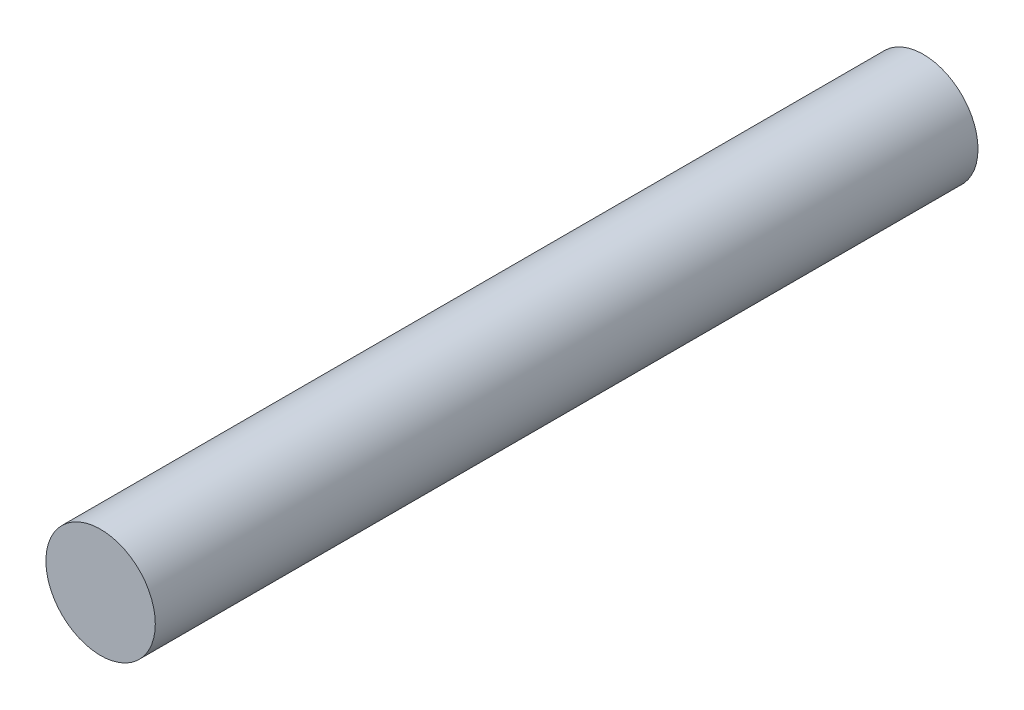
ISO-10303-21;
HEADER;
FILE_DESCRIPTION(('STEP AP214'),'2;1');
FILE_NAME('part.step','',(''),(''),'','','');
FILE_SCHEMA(('AUTOMOTIVE_DESIGN { 1 0 10303 214 1 1 1 1 }'));
ENDSEC;
DATA;
#1=APPLICATION_CONTEXT('core data for automotive mechanical design processes');
#2=APPLICATION_PROTOCOL_DEFINITION('international standard','automotive_design',2000,#1);
#3=PRODUCT_CONTEXT('',#1,'mechanical');
#4=PRODUCT('Part','Part','',(#3));
#5=PRODUCT_RELATED_PRODUCT_CATEGORY('part','',(#4));
#6=PRODUCT_DEFINITION_FORMATION('','',#4);
#7=PRODUCT_DEFINITION_CONTEXT('part definition',#1,'design');
#8=PRODUCT_DEFINITION('design','',#6,#7);
#9=PRODUCT_DEFINITION_SHAPE('','',#8);
#10=(LENGTH_UNIT() NAMED_UNIT(*) SI_UNIT(.MILLI.,.METRE.));
#11=(NAMED_UNIT(*) PLANE_ANGLE_UNIT() SI_UNIT($,.RADIAN.));
#12=(NAMED_UNIT(*) SI_UNIT($,.STERADIAN.) SOLID_ANGLE_UNIT());
#13=UNCERTAINTY_MEASURE_WITH_UNIT(LENGTH_MEASURE(1.E-05),#10,'distance_accuracy_value','');
#14=(GEOMETRIC_REPRESENTATION_CONTEXT(3) GLOBAL_UNCERTAINTY_ASSIGNED_CONTEXT((#13)) GLOBAL_UNIT_ASSIGNED_CONTEXT((#10,
#11,#12)) REPRESENTATION_CONTEXT('',''));
#15=CARTESIAN_POINT('',(0.,0.,0.));
#16=DIRECTION('',(0.,0.,1.));
#17=DIRECTION('',(1.,0.,0.));
#18=AXIS2_PLACEMENT_3D('',#15,#16,#17);
#19=CARTESIAN_POINT('',(0.,0.,47.752));
#20=DIRECTION('',(0.,0.,-1.));
#21=DIRECTION('',(-1.,0.,0.));
#22=AXIS2_PLACEMENT_3D('',#19,#20,#21);
#23=CYLINDRICAL_SURFACE('',#22,3.175);
#24=CARTESIAN_POINT('',(0.,0.,47.752));
#25=DIRECTION('',(0.,0.,1.));
#26=DIRECTION('',(1.,0.,0.));
#27=AXIS2_PLACEMENT_3D('',#24,#25,#26);
#28=CIRCLE('',#27,3.175);
#29=CARTESIAN_POINT('',(3.175,0.,47.752));
#30=VERTEX_POINT('',#29);
#31=EDGE_CURVE('E10',#30,#30,#28,.T.);
#32=ORIENTED_EDGE('',*,*,#31,.F.);
#33=EDGE_LOOP('',(#32));
#34=FACE_BOUND('',#33,.T.);
#35=CARTESIAN_POINT('',(0.,0.,0.));
#36=DIRECTION('',(0.,0.,1.));
#37=DIRECTION('',(1.,0.,0.));
#38=AXIS2_PLACEMENT_3D('',#35,#36,#37);
#39=CIRCLE('',#38,3.175);
#40=CARTESIAN_POINT('',(3.175,0.,0.));
#41=VERTEX_POINT('',#40);
#42=EDGE_CURVE('E34',#41,#41,#39,.T.);
#43=ORIENTED_EDGE('',*,*,#42,.T.);
#44=EDGE_LOOP('',(#43));
#45=FACE_BOUND('',#44,.T.);
#46=ADVANCED_FACE('F31',(#34,#45),#23,.T.);
#47=CARTESIAN_POINT('',(0.,0.,47.752));
#48=DIRECTION('',(0.,0.,1.));
#49=DIRECTION('',(1.,0.,0.));
#50=AXIS2_PLACEMENT_3D('',#47,#48,#49);
#51=PLANE('',#50);
#52=ORIENTED_EDGE('',*,*,#31,.T.);
#53=EDGE_LOOP('',(#52));
#54=FACE_BOUND('',#53,.T.);
#55=ADVANCED_FACE('F46',(#54),#51,.T.);
#56=CARTESIAN_POINT('',(0.,0.,0.));
#57=DIRECTION('',(0.,0.,1.));
#58=DIRECTION('',(1.,0.,0.));
#59=AXIS2_PLACEMENT_3D('',#56,#57,#58);
#60=PLANE('',#59);
#61=ORIENTED_EDGE('',*,*,#42,.F.);
#62=EDGE_LOOP('',(#61));
#63=FACE_BOUND('',#62,.T.);
#64=ADVANCED_FACE('F44',(#63),#60,.F.);
#65=CLOSED_SHELL('',(#46,#55,#64));
#66=MANIFOLD_SOLID_BREP('B2',#65);
#67=ADVANCED_BREP_SHAPE_REPRESENTATION('',(#18,#66),#14);
#68=SHAPE_DEFINITION_REPRESENTATION(#9,#67);
ENDSEC;
END-ISO-10303-21;
